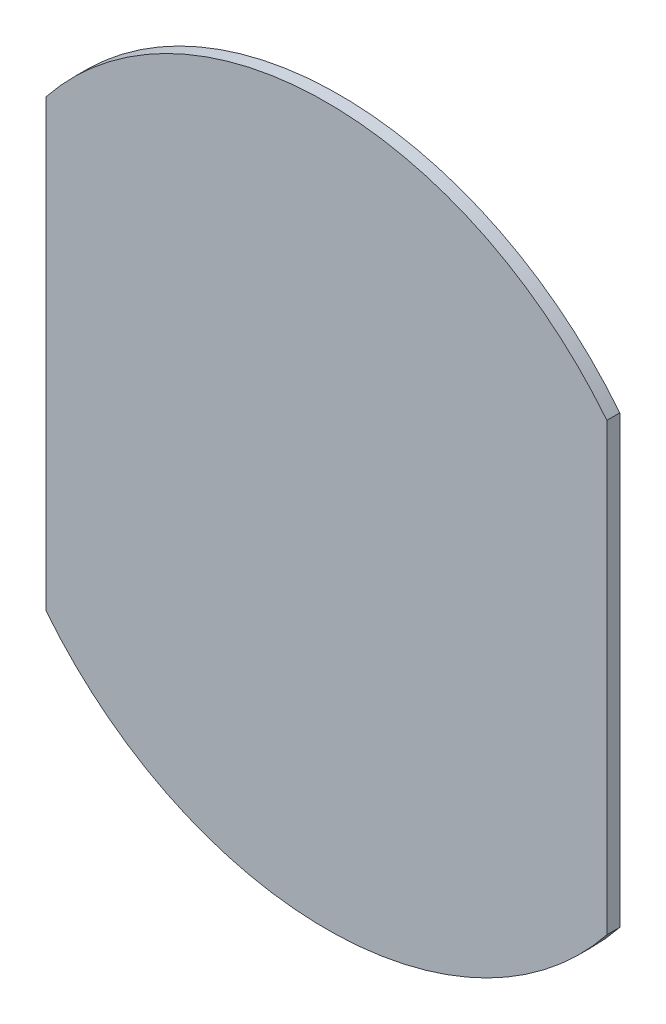
ISO-10303-21;
HEADER;
FILE_DESCRIPTION(('STEP AP214'),'2;1');
FILE_NAME('part.step','',(''),(''),'','','');
FILE_SCHEMA(('AUTOMOTIVE_DESIGN { 1 0 10303 214 1 1 1 1 }'));
ENDSEC;
DATA;
#1=APPLICATION_CONTEXT('core data for automotive mechanical design processes');
#2=APPLICATION_PROTOCOL_DEFINITION('international standard','automotive_design',2000,#1);
#3=PRODUCT_CONTEXT('',#1,'mechanical');
#4=PRODUCT('Part','Part','',(#3));
#5=PRODUCT_RELATED_PRODUCT_CATEGORY('part','',(#4));
#6=PRODUCT_DEFINITION_FORMATION('','',#4);
#7=PRODUCT_DEFINITION_CONTEXT('part definition',#1,'design');
#8=PRODUCT_DEFINITION('design','',#6,#7);
#9=PRODUCT_DEFINITION_SHAPE('','',#8);
#10=(LENGTH_UNIT() NAMED_UNIT(*) SI_UNIT(.MILLI.,.METRE.));
#11=(NAMED_UNIT(*) PLANE_ANGLE_UNIT() SI_UNIT($,.RADIAN.));
#12=(NAMED_UNIT(*) SI_UNIT($,.STERADIAN.) SOLID_ANGLE_UNIT());
#13=UNCERTAINTY_MEASURE_WITH_UNIT(LENGTH_MEASURE(1.E-05),#10,'distance_accuracy_value','');
#14=(GEOMETRIC_REPRESENTATION_CONTEXT(3) GLOBAL_UNCERTAINTY_ASSIGNED_CONTEXT((#13)) GLOBAL_UNIT_ASSIGNED_CONTEXT((#10,
#11,#12)) REPRESENTATION_CONTEXT('',''));
#15=CARTESIAN_POINT('',(0.,0.,0.));
#16=DIRECTION('',(0.,0.,1.));
#17=DIRECTION('',(1.,0.,0.));
#18=AXIS2_PLACEMENT_3D('',#15,#16,#17);
#19=CARTESIAN_POINT('',(0.,0.,1.7));
#20=DIRECTION('',(0.,0.,-1.));
#21=DIRECTION('',(-1.,0.,0.));
#22=AXIS2_PLACEMENT_3D('',#19,#20,#21);
#23=CYLINDRICAL_SURFACE('',#22,47.15);
#24=CARTESIAN_POINT('',(0.,0.,0.));
#25=DIRECTION('',(0.,0.,1.));
#26=DIRECTION('',(1.,0.,0.));
#27=AXIS2_PLACEMENT_3D('',#24,#25,#26);
#28=CIRCLE('',#27,47.15);
#29=CARTESIAN_POINT('',(36.9123565455304,29.3359921300718,0.));
#30=VERTEX_POINT('',#29);
#31=CARTESIAN_POINT('',(-36.9123565455304,29.3359921300718,0.));
#32=VERTEX_POINT('',#31);
#33=EDGE_CURVE('E81',#30,#32,#28,.T.);
#34=ORIENTED_EDGE('',*,*,#33,.T.);
#35=DIRECTION('',(0.,0.,-1.));
#36=VECTOR('',#35,1.);
#37=CARTESIAN_POINT('',(-36.9123565455304,29.3359921300718,1.7));
#38=LINE('',#37,#36);
#39=CARTESIAN_POINT('',(-36.9123565455304,29.3359921300718,1.7));
#40=VERTEX_POINT('',#39);
#41=EDGE_CURVE('E79',#32,#40,#38,.F.);
#42=ORIENTED_EDGE('',*,*,#41,.T.);
#43=CARTESIAN_POINT('',(0.,0.,1.7));
#44=DIRECTION('',(0.,0.,1.));
#45=DIRECTION('',(1.,0.,0.));
#46=AXIS2_PLACEMENT_3D('',#43,#44,#45);
#47=CIRCLE('',#46,47.15);
#48=CARTESIAN_POINT('',(36.9123565455304,29.3359921300718,1.7));
#49=VERTEX_POINT('',#48);
#50=EDGE_CURVE('E87',#49,#40,#47,.T.);
#51=ORIENTED_EDGE('',*,*,#50,.F.);
#52=DIRECTION('',(0.,0.,-1.));
#53=VECTOR('',#52,1.);
#54=CARTESIAN_POINT('',(36.9123565455304,29.3359921300718,1.7));
#55=LINE('',#54,#53);
#56=EDGE_CURVE('E89',#49,#30,#55,.T.);
#57=ORIENTED_EDGE('',*,*,#56,.T.);
#58=EDGE_LOOP('',(#34,#42,#51,#57));
#59=FACE_BOUND('',#58,.T.);
#60=ADVANCED_FACE('F33',(#59),#23,.T.);
#61=CARTESIAN_POINT('',(-36.9123565455304,16.65,1.7));
#62=DIRECTION('',(1.,0.,0.));
#63=DIRECTION('',(0.,0.,-1.));
#64=AXIS2_PLACEMENT_3D('',#61,#62,#63);
#65=PLANE('',#64);
#66=DIRECTION('',(0.,-1.,0.));
#67=VECTOR('',#66,1.);
#68=CARTESIAN_POINT('',(-36.9123565455304,16.65,0.));
#69=LINE('',#68,#67);
#70=CARTESIAN_POINT('',(-36.9123565455304,-29.3359921300719,0.));
#71=VERTEX_POINT('',#70);
#72=EDGE_CURVE('E49',#32,#71,#69,.T.);
#73=ORIENTED_EDGE('',*,*,#72,.T.);
#74=DIRECTION('',(0.,0.,-1.));
#75=VECTOR('',#74,1.);
#76=CARTESIAN_POINT('',(-36.9123565455304,-29.3359921300719,1.7));
#77=LINE('',#76,#75);
#78=CARTESIAN_POINT('',(-36.9123565455304,-29.3359921300719,1.7));
#79=VERTEX_POINT('',#78);
#80=EDGE_CURVE('E76',#79,#71,#77,.T.);
#81=ORIENTED_EDGE('',*,*,#80,.F.);
#82=DIRECTION('',(0.,-1.,0.));
#83=VECTOR('',#82,1.);
#84=CARTESIAN_POINT('',(-36.9123565455304,16.65,1.7));
#85=LINE('',#84,#83);
#86=EDGE_CURVE('E92',#40,#79,#85,.T.);
#87=ORIENTED_EDGE('',*,*,#86,.F.);
#88=ORIENTED_EDGE('',*,*,#41,.F.);
#89=EDGE_LOOP('',(#73,#81,#87,#88));
#90=FACE_BOUND('',#89,.T.);
#91=ADVANCED_FACE('F75',(#90),#65,.F.);
#92=CARTESIAN_POINT('',(0.,0.,1.7));
#93=DIRECTION('',(0.,0.,-1.));
#94=DIRECTION('',(-1.,0.,0.));
#95=AXIS2_PLACEMENT_3D('',#92,#93,#94);
#96=CYLINDRICAL_SURFACE('',#95,47.15);
#97=CARTESIAN_POINT('',(0.,0.,1.7));
#98=DIRECTION('',(0.,0.,1.));
#99=DIRECTION('',(1.,0.,0.));
#100=AXIS2_PLACEMENT_3D('',#97,#98,#99);
#101=CIRCLE('',#100,47.15);
#102=CARTESIAN_POINT('',(36.9123565455304,-29.3359921300719,1.7));
#103=VERTEX_POINT('',#102);
#104=EDGE_CURVE('E41',#79,#103,#101,.T.);
#105=ORIENTED_EDGE('',*,*,#104,.F.);
#106=ORIENTED_EDGE('',*,*,#80,.T.);
#107=CARTESIAN_POINT('',(0.,0.,0.));
#108=DIRECTION('',(0.,0.,1.));
#109=DIRECTION('',(1.,0.,0.));
#110=AXIS2_PLACEMENT_3D('',#107,#108,#109);
#111=CIRCLE('',#110,47.15);
#112=CARTESIAN_POINT('',(36.9123565455304,-29.3359921300719,0.));
#113=VERTEX_POINT('',#112);
#114=EDGE_CURVE('E56',#71,#113,#111,.T.);
#115=ORIENTED_EDGE('',*,*,#114,.T.);
#116=DIRECTION('',(0.,0.,-1.));
#117=VECTOR('',#116,1.);
#118=CARTESIAN_POINT('',(36.9123565455304,-29.3359921300719,1.7));
#119=LINE('',#118,#117);
#120=EDGE_CURVE('E98',#113,#103,#119,.F.);
#121=ORIENTED_EDGE('',*,*,#120,.T.);
#122=EDGE_LOOP('',(#105,#106,#115,#121));
#123=FACE_BOUND('',#122,.T.);
#124=ADVANCED_FACE('F83',(#123),#96,.T.);
#125=CARTESIAN_POINT('',(36.9123565455304,16.65,1.7));
#126=DIRECTION('',(-1.,0.,0.));
#127=DIRECTION('',(0.,0.,1.));
#128=AXIS2_PLACEMENT_3D('',#125,#126,#127);
#129=PLANE('',#128);
#130=DIRECTION('',(0.,1.,0.));
#131=VECTOR('',#130,1.);
#132=CARTESIAN_POINT('',(36.9123565455304,16.65,0.));
#133=LINE('',#132,#131);
#134=EDGE_CURVE('E36',#113,#30,#133,.T.);
#135=ORIENTED_EDGE('',*,*,#134,.T.);
#136=ORIENTED_EDGE('',*,*,#56,.F.);
#137=DIRECTION('',(0.,1.,0.));
#138=VECTOR('',#137,1.);
#139=CARTESIAN_POINT('',(36.9123565455304,16.65,1.7));
#140=LINE('',#139,#138);
#141=EDGE_CURVE('E11',#103,#49,#140,.T.);
#142=ORIENTED_EDGE('',*,*,#141,.F.);
#143=ORIENTED_EDGE('',*,*,#120,.F.);
#144=EDGE_LOOP('',(#135,#136,#142,#143));
#145=FACE_BOUND('',#144,.T.);
#146=ADVANCED_FACE('F107',(#145),#129,.F.);
#147=CARTESIAN_POINT('',(0.,0.,1.7));
#148=DIRECTION('',(0.,0.,1.));
#149=DIRECTION('',(1.,0.,0.));
#150=AXIS2_PLACEMENT_3D('',#147,#148,#149);
#151=PLANE('',#150);
#152=ORIENTED_EDGE('',*,*,#86,.T.);
#153=ORIENTED_EDGE('',*,*,#104,.T.);
#154=ORIENTED_EDGE('',*,*,#141,.T.);
#155=ORIENTED_EDGE('',*,*,#50,.T.);
#156=EDGE_LOOP('',(#152,#153,#154,#155));
#157=FACE_BOUND('',#156,.T.);
#158=ADVANCED_FACE('F103',(#157),#151,.T.);
#159=CARTESIAN_POINT('',(0.,0.,0.));
#160=DIRECTION('',(0.,0.,1.));
#161=DIRECTION('',(1.,0.,0.));
#162=AXIS2_PLACEMENT_3D('',#159,#160,#161);
#163=PLANE('',#162);
#164=ORIENTED_EDGE('',*,*,#114,.F.);
#165=ORIENTED_EDGE('',*,*,#72,.F.);
#166=ORIENTED_EDGE('',*,*,#33,.F.);
#167=ORIENTED_EDGE('',*,*,#134,.F.);
#168=EDGE_LOOP('',(#164,#165,#166,#167));
#169=FACE_BOUND('',#168,.T.);
#170=ADVANCED_FACE('F85',(#169),#163,.F.);
#171=CLOSED_SHELL('',(#60,#91,#124,#146,#158,#170));
#172=MANIFOLD_SOLID_BREP('B2',#171);
#173=ADVANCED_BREP_SHAPE_REPRESENTATION('',(#18,#172),#14);
#174=SHAPE_DEFINITION_REPRESENTATION(#9,#173);
ENDSEC;
END-ISO-10303-21;
